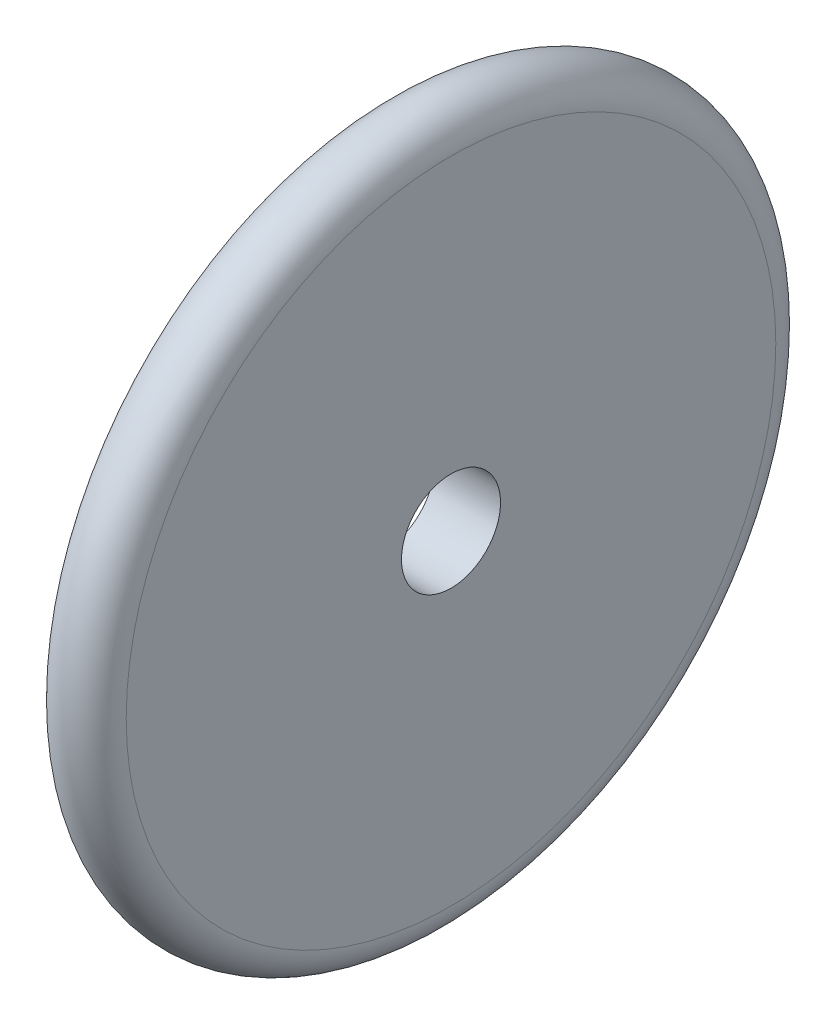
ISO-10303-21;
HEADER;
FILE_DESCRIPTION(('STEP AP214'),'2;1');
FILE_NAME('part.step','',(''),(''),'','','');
FILE_SCHEMA(('AUTOMOTIVE_DESIGN { 1 0 10303 214 1 1 1 1 }'));
ENDSEC;
DATA;
#1=APPLICATION_CONTEXT('core data for automotive mechanical design processes');
#2=APPLICATION_PROTOCOL_DEFINITION('international standard','automotive_design',2000,#1);
#3=PRODUCT_CONTEXT('',#1,'mechanical');
#4=PRODUCT('Part','Part','',(#3));
#5=PRODUCT_RELATED_PRODUCT_CATEGORY('part','',(#4));
#6=PRODUCT_DEFINITION_FORMATION('','',#4);
#7=PRODUCT_DEFINITION_CONTEXT('part definition',#1,'design');
#8=PRODUCT_DEFINITION('design','',#6,#7);
#9=PRODUCT_DEFINITION_SHAPE('','',#8);
#10=(LENGTH_UNIT() NAMED_UNIT(*) SI_UNIT(.MILLI.,.METRE.));
#11=(NAMED_UNIT(*) PLANE_ANGLE_UNIT() SI_UNIT($,.RADIAN.));
#12=(NAMED_UNIT(*) SI_UNIT($,.STERADIAN.) SOLID_ANGLE_UNIT());
#13=UNCERTAINTY_MEASURE_WITH_UNIT(LENGTH_MEASURE(1.E-05),#10,'distance_accuracy_value','');
#14=(GEOMETRIC_REPRESENTATION_CONTEXT(3) GLOBAL_UNCERTAINTY_ASSIGNED_CONTEXT((#13)) GLOBAL_UNIT_ASSIGNED_CONTEXT((#10,
#11,#12)) REPRESENTATION_CONTEXT('',''));
#15=CARTESIAN_POINT('',(0.,0.,0.));
#16=DIRECTION('',(0.,0.,1.));
#17=DIRECTION('',(1.,0.,0.));
#18=AXIS2_PLACEMENT_3D('',#15,#16,#17);
#19=CARTESIAN_POINT('',(9.525,0.,44.45));
#20=DIRECTION('',(-1.,0.,0.));
#21=DIRECTION('',(0.,0.,1.));
#22=AXIS2_PLACEMENT_3D('',#19,#20,#21);
#23=PLANE('',#22);
#24=CARTESIAN_POINT('',(9.525,0.,58.7375));
#25=DIRECTION('',(-1.,0.,0.));
#26=DIRECTION('',(0.,0.,1.));
#27=AXIS2_PLACEMENT_3D('',#24,#25,#26);
#28=CIRCLE('',#27,93.6625);
#29=CARTESIAN_POINT('',(9.525,0.,152.4));
#30=VERTEX_POINT('',#29);
#31=EDGE_CURVE('E45',#30,#30,#28,.T.);
#32=ORIENTED_EDGE('',*,*,#31,.F.);
#33=EDGE_LOOP('',(#32));
#34=FACE_BOUND('',#33,.T.);
#35=CARTESIAN_POINT('',(9.525,0.,58.7375));
#36=DIRECTION('',(-1.,0.,0.));
#37=DIRECTION('',(0.,0.,1.));
#38=AXIS2_PLACEMENT_3D('',#35,#36,#37);
#39=CIRCLE('',#38,14.2875);
#40=CARTESIAN_POINT('',(9.525,0.,73.025));
#41=VERTEX_POINT('',#40);
#42=EDGE_CURVE('E10',#41,#41,#39,.T.);
#43=ORIENTED_EDGE('',*,*,#42,.T.);
#44=EDGE_LOOP('',(#43));
#45=FACE_BOUND('',#44,.T.);
#46=ADVANCED_FACE('F31',(#34,#45),#23,.F.);
#47=CARTESIAN_POINT('',(-9.525,0.,58.7375));
#48=DIRECTION('',(-1.,0.,0.));
#49=DIRECTION('',(0.,0.,1.));
#50=AXIS2_PLACEMENT_3D('',#47,#48,#49);
#51=CYLINDRICAL_SURFACE('',#50,14.2875);
#52=ORIENTED_EDGE('',*,*,#42,.F.);
#53=EDGE_LOOP('',(#52));
#54=FACE_BOUND('',#53,.T.);
#55=CARTESIAN_POINT('',(-9.525,0.,58.7375));
#56=DIRECTION('',(-1.,0.,0.));
#57=DIRECTION('',(0.,0.,1.));
#58=AXIS2_PLACEMENT_3D('',#55,#56,#57);
#59=CIRCLE('',#58,14.2875);
#60=CARTESIAN_POINT('',(-9.525,0.,73.025));
#61=VERTEX_POINT('',#60);
#62=EDGE_CURVE('E37',#61,#61,#59,.T.);
#63=ORIENTED_EDGE('',*,*,#62,.T.);
#64=EDGE_LOOP('',(#63));
#65=FACE_BOUND('',#64,.T.);
#66=ADVANCED_FACE('F54',(#54,#65),#51,.F.);
#67=CARTESIAN_POINT('',(-9.525,0.,44.45));
#68=DIRECTION('',(1.,0.,0.));
#69=DIRECTION('',(0.,0.,-1.));
#70=AXIS2_PLACEMENT_3D('',#67,#68,#69);
#71=PLANE('',#70);
#72=ORIENTED_EDGE('',*,*,#62,.F.);
#73=EDGE_LOOP('',(#72));
#74=FACE_BOUND('',#73,.T.);
#75=CARTESIAN_POINT('',(-9.525,0.,58.7375));
#76=DIRECTION('',(-1.,0.,0.));
#77=DIRECTION('',(0.,0.,1.));
#78=AXIS2_PLACEMENT_3D('',#75,#76,#77);
#79=CIRCLE('',#78,93.6625);
#80=CARTESIAN_POINT('',(-9.525,0.,152.4));
#81=VERTEX_POINT('',#80);
#82=EDGE_CURVE('E41',#81,#81,#79,.T.);
#83=ORIENTED_EDGE('',*,*,#82,.T.);
#84=EDGE_LOOP('',(#83));
#85=FACE_BOUND('',#84,.T.);
#86=ADVANCED_FACE('F58',(#74,#85),#71,.F.);
#87=CARTESIAN_POINT('',(0.,0.,58.7375));
#88=DIRECTION('',(-1.,0.,0.));
#89=DIRECTION('',(0.,0.,1.));
#90=AXIS2_PLACEMENT_3D('',#87,#88,#89);
#91=TOROIDAL_SURFACE('',#90,93.6625,9.525);
#92=ORIENTED_EDGE('',*,*,#82,.F.);
#93=EDGE_LOOP('',(#92));
#94=FACE_BOUND('',#93,.T.);
#95=ORIENTED_EDGE('',*,*,#31,.T.);
#96=EDGE_LOOP('',(#95));
#97=FACE_BOUND('',#96,.T.);
#98=ADVANCED_FACE('F51',(#94,#97),#91,.T.);
#99=CLOSED_SHELL('',(#46,#66,#86,#98));
#100=MANIFOLD_SOLID_BREP('B2',#99);
#101=ADVANCED_BREP_SHAPE_REPRESENTATION('',(#18,#100),#14);
#102=SHAPE_DEFINITION_REPRESENTATION(#9,#101);
ENDSEC;
END-ISO-10303-21;
